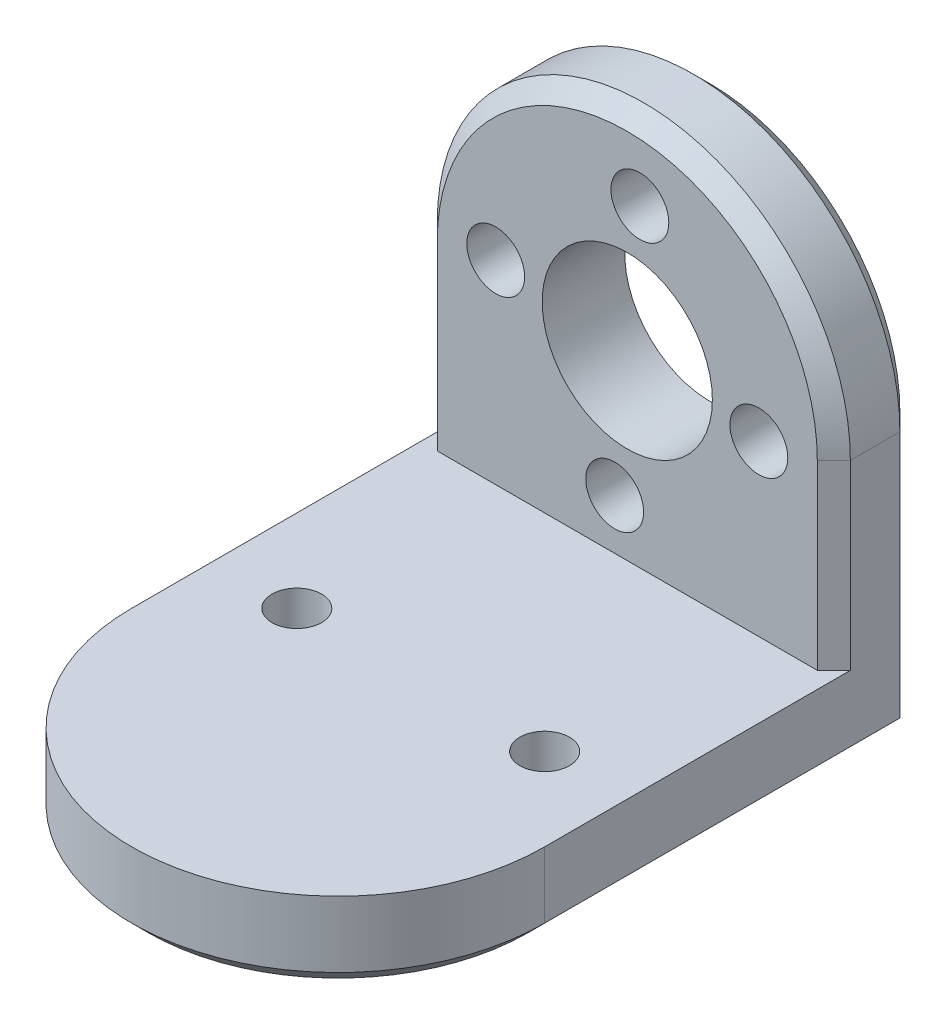
ISO-10303-21;
HEADER;
FILE_DESCRIPTION(('STEP AP214'),'2;1');
FILE_NAME('part.step','',(''),(''),'','','');
FILE_SCHEMA(('AUTOMOTIVE_DESIGN { 1 0 10303 214 1 1 1 1 }'));
ENDSEC;
DATA;
#1=APPLICATION_CONTEXT('core data for automotive mechanical design processes');
#2=APPLICATION_PROTOCOL_DEFINITION('international standard','automotive_design',2000,#1);
#3=PRODUCT_CONTEXT('',#1,'mechanical');
#4=PRODUCT('Part','Part','',(#3));
#5=PRODUCT_RELATED_PRODUCT_CATEGORY('part','',(#4));
#6=PRODUCT_DEFINITION_FORMATION('','',#4);
#7=PRODUCT_DEFINITION_CONTEXT('part definition',#1,'design');
#8=PRODUCT_DEFINITION('design','',#6,#7);
#9=PRODUCT_DEFINITION_SHAPE('','',#8);
#10=(LENGTH_UNIT() NAMED_UNIT(*) SI_UNIT(.MILLI.,.METRE.));
#11=(NAMED_UNIT(*) PLANE_ANGLE_UNIT() SI_UNIT($,.RADIAN.));
#12=(NAMED_UNIT(*) SI_UNIT($,.STERADIAN.) SOLID_ANGLE_UNIT());
#13=UNCERTAINTY_MEASURE_WITH_UNIT(LENGTH_MEASURE(1.E-05),#10,'distance_accuracy_value','');
#14=(GEOMETRIC_REPRESENTATION_CONTEXT(3) GLOBAL_UNCERTAINTY_ASSIGNED_CONTEXT((#13)) GLOBAL_UNIT_ASSIGNED_CONTEXT((#10,
#11,#12)) REPRESENTATION_CONTEXT('',''));
#15=CARTESIAN_POINT('',(0.,0.,0.));
#16=DIRECTION('',(0.,0.,1.));
#17=DIRECTION('',(1.,0.,0.));
#18=AXIS2_PLACEMENT_3D('',#15,#16,#17);
#19=CARTESIAN_POINT('',(12.5,-16.,5.));
#20=DIRECTION('',(0.,-1.,0.));
#21=DIRECTION('',(1.,0.,0.));
#22=AXIS2_PLACEMENT_3D('',#19,#20,#21);
#23=PLANE('',#22);
#24=DIRECTION('',(-1.,0.,0.));
#25=VECTOR('',#24,1.);
#26=CARTESIAN_POINT('',(12.5,-16.,0.));
#27=LINE('',#26,#25);
#28=CARTESIAN_POINT('',(11.5,-16.,0.));
#29=VERTEX_POINT('',#28);
#30=CARTESIAN_POINT('',(-11.5,-16.,0.));
#31=VERTEX_POINT('',#30);
#32=EDGE_CURVE('E158',#29,#31,#27,.T.);
#33=ORIENTED_EDGE('',*,*,#32,.F.);
#34=DIRECTION('',(0.,0.,1.));
#35=VECTOR('',#34,1.);
#36=CARTESIAN_POINT('',(11.5,-16.,5.));
#37=LINE('',#36,#35);
#38=CARTESIAN_POINT('',(11.5,-16.,22.5));
#39=VERTEX_POINT('',#38);
#40=EDGE_CURVE('E55',#29,#39,#37,.T.);
#41=ORIENTED_EDGE('',*,*,#40,.T.);
#42=CARTESIAN_POINT('',(0.,-16.,22.5));
#43=DIRECTION('',(0.,-1.,0.));
#44=DIRECTION('',(1.,0.,0.));
#45=AXIS2_PLACEMENT_3D('',#42,#43,#44);
#46=CIRCLE('',#45,11.5);
#47=CARTESIAN_POINT('',(-11.5,-16.,22.5));
#48=VERTEX_POINT('',#47);
#49=EDGE_CURVE('E63',#39,#48,#46,.T.);
#50=ORIENTED_EDGE('',*,*,#49,.T.);
#51=DIRECTION('',(0.,0.,-1.));
#52=VECTOR('',#51,1.);
#53=CARTESIAN_POINT('',(-11.5,-16.,5.));
#54=LINE('',#53,#52);
#55=EDGE_CURVE('E217',#48,#31,#54,.T.);
#56=ORIENTED_EDGE('',*,*,#55,.T.);
#57=EDGE_LOOP('',(#33,#41,#50,#56));
#58=FACE_BOUND('',#57,.T.);
#59=CARTESIAN_POINT('',(7.5,-16.,17.5));
#60=DIRECTION('',(0.,-1.,0.));
#61=DIRECTION('',(0.,0.,-1.));
#62=AXIS2_PLACEMENT_3D('',#59,#60,#61);
#63=CIRCLE('',#62,1.5);
#64=CARTESIAN_POINT('',(7.5,-16.,16.));
#65=VERTEX_POINT('',#64);
#66=EDGE_CURVE('E199',#65,#65,#63,.T.);
#67=ORIENTED_EDGE('',*,*,#66,.F.);
#68=EDGE_LOOP('',(#67));
#69=FACE_BOUND('',#68,.T.);
#70=CARTESIAN_POINT('',(-7.5,-16.,17.5));
#71=DIRECTION('',(0.,1.,0.));
#72=DIRECTION('',(0.,0.,1.));
#73=AXIS2_PLACEMENT_3D('',#70,#71,#72);
#74=CIRCLE('',#73,1.5);
#75=CARTESIAN_POINT('',(-7.5,-16.,19.));
#76=VERTEX_POINT('',#75);
#77=EDGE_CURVE('E291',#76,#76,#74,.T.);
#78=ORIENTED_EDGE('',*,*,#77,.T.);
#79=EDGE_LOOP('',(#78));
#80=FACE_BOUND('',#79,.T.);
#81=ADVANCED_FACE('F45',(#58,#69,#80),#23,.T.);
#82=CARTESIAN_POINT('',(-12.5,-11.,35.));
#83=DIRECTION('',(0.,-1.,0.));
#84=DIRECTION('',(0.,0.,-1.));
#85=AXIS2_PLACEMENT_3D('',#82,#83,#84);
#86=PLANE('',#85);
#87=DIRECTION('',(0.,0.,-1.));
#88=VECTOR('',#87,1.);
#89=CARTESIAN_POINT('',(-12.5,-11.,35.));
#90=LINE('',#89,#88);
#91=CARTESIAN_POINT('',(-12.5,-11.,22.5));
#92=VERTEX_POINT('',#91);
#93=CARTESIAN_POINT('',(-12.5,-11.,4.));
#94=VERTEX_POINT('',#93);
#95=EDGE_CURVE('E132',#92,#94,#90,.T.);
#96=ORIENTED_EDGE('',*,*,#95,.F.);
#97=CARTESIAN_POINT('',(0.,-11.,22.5));
#98=DIRECTION('',(0.,-1.,0.));
#99=DIRECTION('',(0.,0.,-1.));
#100=AXIS2_PLACEMENT_3D('',#97,#98,#99);
#101=CIRCLE('',#100,12.5);
#102=CARTESIAN_POINT('',(12.5,-11.,22.5));
#103=VERTEX_POINT('',#102);
#104=EDGE_CURVE('E142',#92,#103,#101,.F.);
#105=ORIENTED_EDGE('',*,*,#104,.T.);
#106=DIRECTION('',(0.,0.,-1.));
#107=VECTOR('',#106,1.);
#108=CARTESIAN_POINT('',(12.5,-11.,35.));
#109=LINE('',#108,#107);
#110=CARTESIAN_POINT('',(12.5,-11.,4.));
#111=VERTEX_POINT('',#110);
#112=EDGE_CURVE('E155',#103,#111,#109,.T.);
#113=ORIENTED_EDGE('',*,*,#112,.T.);
#114=DIRECTION('',(0.707106781186544,0.,-0.707106781186551));
#115=VECTOR('',#114,1.);
#116=CARTESIAN_POINT('',(-15.4999999999999,-11.,32.0000000000001));
#117=LINE('',#116,#115);
#118=CARTESIAN_POINT('',(11.5,-11.,5.));
#119=VERTEX_POINT('',#118);
#120=EDGE_CURVE('E189',#111,#119,#117,.F.);
#121=ORIENTED_EDGE('',*,*,#120,.T.);
#122=DIRECTION('',(-1.,0.,0.));
#123=VECTOR('',#122,1.);
#124=CARTESIAN_POINT('',(-12.5,-11.,5.));
#125=LINE('',#124,#123);
#126=CARTESIAN_POINT('',(-11.5,-11.,5.));
#127=VERTEX_POINT('',#126);
#128=EDGE_CURVE('E156',#119,#127,#125,.T.);
#129=ORIENTED_EDGE('',*,*,#128,.T.);
#130=DIRECTION('',(0.707106781186544,0.,0.707106781186551));
#131=VECTOR('',#130,1.);
#132=CARTESIAN_POINT('',(2.99999999999999,-11.,19.5000000000001));
#133=LINE('',#132,#131);
#134=EDGE_CURVE('E153',#127,#94,#133,.F.);
#135=ORIENTED_EDGE('',*,*,#134,.T.);
#136=EDGE_LOOP('',(#96,#105,#113,#121,#129,#135));
#137=FACE_BOUND('',#136,.T.);
#138=CARTESIAN_POINT('',(7.5,-11.,17.5));
#139=DIRECTION('',(0.,-1.,0.));
#140=DIRECTION('',(0.,0.,-1.));
#141=AXIS2_PLACEMENT_3D('',#138,#139,#140);
#142=CIRCLE('',#141,1.5);
#143=CARTESIAN_POINT('',(7.5,-11.,16.));
#144=VERTEX_POINT('',#143);
#145=EDGE_CURVE('E300',#144,#144,#142,.T.);
#146=ORIENTED_EDGE('',*,*,#145,.T.);
#147=EDGE_LOOP('',(#146));
#148=FACE_BOUND('',#147,.T.);
#149=CARTESIAN_POINT('',(-7.5,-11.,17.5));
#150=DIRECTION('',(0.,1.,0.));
#151=DIRECTION('',(0.,0.,1.));
#152=AXIS2_PLACEMENT_3D('',#149,#150,#151);
#153=CIRCLE('',#152,1.5);
#154=CARTESIAN_POINT('',(-7.5,-11.,19.));
#155=VERTEX_POINT('',#154);
#156=EDGE_CURVE('E294',#155,#155,#153,.T.);
#157=ORIENTED_EDGE('',*,*,#156,.F.);
#158=EDGE_LOOP('',(#157));
#159=FACE_BOUND('',#158,.T.);
#160=ADVANCED_FACE('F149',(#137,#148,#159),#86,.F.);
#161=CARTESIAN_POINT('',(0.,-16.,22.5));
#162=DIRECTION('',(0.,-1.,0.));
#163=DIRECTION('',(1.,0.,0.));
#164=AXIS2_PLACEMENT_3D('',#161,#162,#163);
#165=CYLINDRICAL_SURFACE('',#164,12.5);
#166=DIRECTION('',(0.,-1.,0.));
#167=VECTOR('',#166,1.);
#168=CARTESIAN_POINT('',(-12.5,0.,22.5));
#169=LINE('',#168,#167);
#170=CARTESIAN_POINT('',(-12.5,-15.,22.5));
#171=VERTEX_POINT('',#170);
#172=EDGE_CURVE('E127',#171,#92,#169,.F.);
#173=ORIENTED_EDGE('',*,*,#172,.F.);
#174=CARTESIAN_POINT('',(0.,-15.,22.5));
#175=DIRECTION('',(0.,-1.,0.));
#176=DIRECTION('',(1.,0.,0.));
#177=AXIS2_PLACEMENT_3D('',#174,#175,#176);
#178=CIRCLE('',#177,12.5);
#179=CARTESIAN_POINT('',(12.5,-15.,22.5));
#180=VERTEX_POINT('',#179);
#181=EDGE_CURVE('E11',#171,#180,#178,.F.);
#182=ORIENTED_EDGE('',*,*,#181,.T.);
#183=DIRECTION('',(0.,-1.,0.));
#184=VECTOR('',#183,1.);
#185=CARTESIAN_POINT('',(12.5,0.,22.5));
#186=LINE('',#185,#184);
#187=EDGE_CURVE('E138',#103,#180,#186,.T.);
#188=ORIENTED_EDGE('',*,*,#187,.F.);
#189=ORIENTED_EDGE('',*,*,#104,.F.);
#190=EDGE_LOOP('',(#173,#182,#188,#189));
#191=FACE_BOUND('',#190,.T.);
#192=ADVANCED_FACE('F143',(#191),#165,.T.);
#193=CARTESIAN_POINT('',(0.,0.,5.));
#194=DIRECTION('',(0.,0.,-1.));
#195=DIRECTION('',(-1.,0.,0.));
#196=AXIS2_PLACEMENT_3D('',#193,#194,#195);
#197=CYLINDRICAL_SURFACE('',#196,12.5);
#198=DIRECTION('',(0.,0.,-1.));
#199=VECTOR('',#198,1.);
#200=CARTESIAN_POINT('',(12.5,0.,5.));
#201=LINE('',#200,#199);
#202=CARTESIAN_POINT('',(12.5,0.,4.));
#203=VERTEX_POINT('',#202);
#204=CARTESIAN_POINT('',(12.5,0.,1.));
#205=VERTEX_POINT('',#204);
#206=EDGE_CURVE('E166',#203,#205,#201,.T.);
#207=ORIENTED_EDGE('',*,*,#206,.T.);
#208=CARTESIAN_POINT('',(0.,0.,1.));
#209=DIRECTION('',(0.,0.,1.));
#210=DIRECTION('',(1.,0.,0.));
#211=AXIS2_PLACEMENT_3D('',#208,#209,#210);
#212=CIRCLE('',#211,12.5);
#213=CARTESIAN_POINT('',(-12.5,0.,1.00000000000001));
#214=VERTEX_POINT('',#213);
#215=EDGE_CURVE('E211',#205,#214,#212,.T.);
#216=ORIENTED_EDGE('',*,*,#215,.T.);
#217=DIRECTION('',(0.,0.,-1.));
#218=VECTOR('',#217,1.);
#219=CARTESIAN_POINT('',(-12.5,0.,5.));
#220=LINE('',#219,#218);
#221=CARTESIAN_POINT('',(-12.5,0.,4.));
#222=VERTEX_POINT('',#221);
#223=EDGE_CURVE('E167',#222,#214,#220,.T.);
#224=ORIENTED_EDGE('',*,*,#223,.F.);
#225=CARTESIAN_POINT('',(0.,0.,4.));
#226=DIRECTION('',(0.,0.,1.));
#227=DIRECTION('',(1.,0.,0.));
#228=AXIS2_PLACEMENT_3D('',#225,#226,#227);
#229=CIRCLE('',#228,12.5);
#230=EDGE_CURVE('E187',#222,#203,#229,.F.);
#231=ORIENTED_EDGE('',*,*,#230,.T.);
#232=EDGE_LOOP('',(#207,#216,#224,#231));
#233=FACE_BOUND('',#232,.T.);
#234=ADVANCED_FACE('F268',(#233),#197,.T.);
#235=CARTESIAN_POINT('',(0.,0.,5.));
#236=DIRECTION('',(0.,0.,1.));
#237=DIRECTION('',(1.,0.,0.));
#238=AXIS2_PLACEMENT_3D('',#235,#236,#237);
#239=PLANE('',#238);
#240=ORIENTED_EDGE('',*,*,#128,.F.);
#241=DIRECTION('',(0.,1.,0.));
#242=VECTOR('',#241,1.);
#243=CARTESIAN_POINT('',(11.5,0.,5.));
#244=LINE('',#243,#242);
#245=CARTESIAN_POINT('',(11.5,0.,5.));
#246=VERTEX_POINT('',#245);
#247=EDGE_CURVE('E183',#119,#246,#244,.T.);
#248=ORIENTED_EDGE('',*,*,#247,.T.);
#249=CARTESIAN_POINT('',(0.,0.,5.));
#250=DIRECTION('',(0.,0.,1.));
#251=DIRECTION('',(1.,0.,0.));
#252=AXIS2_PLACEMENT_3D('',#249,#250,#251);
#253=CIRCLE('',#252,11.5);
#254=CARTESIAN_POINT('',(-11.5,0.,5.));
#255=VERTEX_POINT('',#254);
#256=EDGE_CURVE('E179',#246,#255,#253,.T.);
#257=ORIENTED_EDGE('',*,*,#256,.T.);
#258=DIRECTION('',(0.,-1.,0.));
#259=VECTOR('',#258,1.);
#260=CARTESIAN_POINT('',(-11.5,0.,5.));
#261=LINE('',#260,#259);
#262=EDGE_CURVE('E181',#255,#127,#261,.T.);
#263=ORIENTED_EDGE('',*,*,#262,.T.);
#264=EDGE_LOOP('',(#240,#248,#257,#263));
#265=FACE_BOUND('',#264,.T.);
#266=CARTESIAN_POINT('',(0.762684290658525,7.96356155704086,5.));
#267=DIRECTION('',(0.,0.,1.));
#268=DIRECTION('',(1.,0.,0.));
#269=AXIS2_PLACEMENT_3D('',#266,#267,#268);
#270=CIRCLE('',#269,1.75000000000144);
#271=CARTESIAN_POINT('',(2.51268429065997,7.96356155704086,5.));
#272=VERTEX_POINT('',#271);
#273=EDGE_CURVE('E160',#272,#272,#270,.T.);
#274=ORIENTED_EDGE('',*,*,#273,.F.);
#275=EDGE_LOOP('',(#274));
#276=FACE_BOUND('',#275,.T.);
#277=CARTESIAN_POINT('',(7.96356155704106,-0.762684290658769,5.));
#278=DIRECTION('',(0.,0.,1.));
#279=DIRECTION('',(1.,0.,0.));
#280=AXIS2_PLACEMENT_3D('',#277,#278,#279);
#281=CIRCLE('',#280,1.75000000000156);
#282=CARTESIAN_POINT('',(9.71356155704262,-0.762684290658769,5.));
#283=VERTEX_POINT('',#282);
#284=EDGE_CURVE('E320',#283,#283,#281,.T.);
#285=ORIENTED_EDGE('',*,*,#284,.F.);
#286=EDGE_LOOP('',(#285));
#287=FACE_BOUND('',#286,.T.);
#288=CARTESIAN_POINT('',(-7.96356155704111,0.762684290658319,5.));
#289=DIRECTION('',(0.,0.,1.));
#290=DIRECTION('',(1.,0.,0.));
#291=AXIS2_PLACEMENT_3D('',#288,#289,#290);
#292=CIRCLE('',#291,1.75000000000108);
#293=CARTESIAN_POINT('',(-6.21356155704003,0.762684290658319,5.));
#294=VERTEX_POINT('',#293);
#295=EDGE_CURVE('E317',#294,#294,#292,.T.);
#296=ORIENTED_EDGE('',*,*,#295,.F.);
#297=EDGE_LOOP('',(#296));
#298=FACE_BOUND('',#297,.T.);
#299=CARTESIAN_POINT('',(-0.76268429065857,-7.96356155704131,5.));
#300=DIRECTION('',(0.,0.,1.));
#301=DIRECTION('',(1.,0.,0.));
#302=AXIS2_PLACEMENT_3D('',#299,#300,#301);
#303=CIRCLE('',#302,1.75000000000126);
#304=CARTESIAN_POINT('',(0.98731570934269,-7.96356155704131,5.));
#305=VERTEX_POINT('',#304);
#306=EDGE_CURVE('E309',#305,#305,#303,.T.);
#307=ORIENTED_EDGE('',*,*,#306,.F.);
#308=EDGE_LOOP('',(#307));
#309=FACE_BOUND('',#308,.T.);
#310=CARTESIAN_POINT('',(0.,0.,5.));
#311=DIRECTION('',(0.,0.,1.));
#312=DIRECTION('',(1.,0.,0.));
#313=AXIS2_PLACEMENT_3D('',#310,#311,#312);
#314=CIRCLE('',#313,5.15);
#315=CARTESIAN_POINT('',(5.15,0.,5.));
#316=VERTEX_POINT('',#315);
#317=EDGE_CURVE('E139',#316,#316,#314,.T.);
#318=ORIENTED_EDGE('',*,*,#317,.F.);
#319=EDGE_LOOP('',(#318));
#320=FACE_BOUND('',#319,.T.);
#321=ADVANCED_FACE('F257',(#265,#276,#287,#298,#309,#320),#239,.T.);
#322=CARTESIAN_POINT('',(0.,0.,0.));
#323=DIRECTION('',(0.,0.,1.));
#324=DIRECTION('',(1.,0.,0.));
#325=AXIS2_PLACEMENT_3D('',#322,#323,#324);
#326=PLANE('',#325);
#327=CARTESIAN_POINT('',(0.762684290658525,7.96356155704086,0.));
#328=DIRECTION('',(0.,0.,-1.));
#329=DIRECTION('',(-1.,0.,0.));
#330=AXIS2_PLACEMENT_3D('',#327,#328,#329);
#331=CIRCLE('',#330,1.75000000000144);
#332=CARTESIAN_POINT('',(-0.987315709342918,7.96356155704086,0.));
#333=VERTEX_POINT('',#332);
#334=EDGE_CURVE('E306',#333,#333,#331,.T.);
#335=ORIENTED_EDGE('',*,*,#334,.F.);
#336=EDGE_LOOP('',(#335));
#337=FACE_BOUND('',#336,.T.);
#338=CARTESIAN_POINT('',(7.96356155704106,-0.762684290658769,0.));
#339=DIRECTION('',(0.,0.,-1.));
#340=DIRECTION('',(-1.,0.,0.));
#341=AXIS2_PLACEMENT_3D('',#338,#339,#340);
#342=CIRCLE('',#341,1.75000000000156);
#343=CARTESIAN_POINT('',(6.2135615570395,-0.762684290658769,0.));
#344=VERTEX_POINT('',#343);
#345=EDGE_CURVE('E310',#344,#344,#342,.T.);
#346=ORIENTED_EDGE('',*,*,#345,.F.);
#347=EDGE_LOOP('',(#346));
#348=FACE_BOUND('',#347,.T.);
#349=CARTESIAN_POINT('',(-7.96356155704111,0.762684290658319,0.));
#350=DIRECTION('',(0.,0.,-1.));
#351=DIRECTION('',(-1.,0.,0.));
#352=AXIS2_PLACEMENT_3D('',#349,#350,#351);
#353=CIRCLE('',#352,1.75000000000108);
#354=CARTESIAN_POINT('',(-9.71356155704219,0.762684290658319,0.));
#355=VERTEX_POINT('',#354);
#356=EDGE_CURVE('E297',#355,#355,#353,.T.);
#357=ORIENTED_EDGE('',*,*,#356,.F.);
#358=EDGE_LOOP('',(#357));
#359=FACE_BOUND('',#358,.T.);
#360=CARTESIAN_POINT('',(-0.76268429065857,-7.96356155704131,0.));
#361=DIRECTION('',(0.,0.,-1.));
#362=DIRECTION('',(-1.,0.,0.));
#363=AXIS2_PLACEMENT_3D('',#360,#361,#362);
#364=CIRCLE('',#363,1.75000000000126);
#365=CARTESIAN_POINT('',(-2.51268429065983,-7.96356155704131,0.));
#366=VERTEX_POINT('',#365);
#367=EDGE_CURVE('E293',#366,#366,#364,.T.);
#368=ORIENTED_EDGE('',*,*,#367,.F.);
#369=EDGE_LOOP('',(#368));
#370=FACE_BOUND('',#369,.T.);
#371=CARTESIAN_POINT('',(0.,0.,0.));
#372=DIRECTION('',(0.,0.,1.));
#373=DIRECTION('',(1.,0.,0.));
#374=AXIS2_PLACEMENT_3D('',#371,#372,#373);
#375=CIRCLE('',#374,11.5);
#376=CARTESIAN_POINT('',(-11.5,0.,0.));
#377=VERTEX_POINT('',#376);
#378=CARTESIAN_POINT('',(11.5,0.,0.));
#379=VERTEX_POINT('',#378);
#380=EDGE_CURVE('E201',#377,#379,#375,.F.);
#381=ORIENTED_EDGE('',*,*,#380,.T.);
#382=DIRECTION('',(0.,-1.,0.));
#383=VECTOR('',#382,1.);
#384=CARTESIAN_POINT('',(11.5,-16.,0.));
#385=LINE('',#384,#383);
#386=EDGE_CURVE('E203',#379,#29,#385,.T.);
#387=ORIENTED_EDGE('',*,*,#386,.T.);
#388=ORIENTED_EDGE('',*,*,#32,.T.);
#389=DIRECTION('',(0.,1.,0.));
#390=VECTOR('',#389,1.);
#391=CARTESIAN_POINT('',(-11.5,0.,0.));
#392=LINE('',#391,#390);
#393=EDGE_CURVE('E192',#31,#377,#392,.T.);
#394=ORIENTED_EDGE('',*,*,#393,.T.);
#395=EDGE_LOOP('',(#381,#387,#388,#394));
#396=FACE_BOUND('',#395,.T.);
#397=CARTESIAN_POINT('',(0.,0.,0.));
#398=DIRECTION('',(0.,0.,1.));
#399=DIRECTION('',(1.,0.,0.));
#400=AXIS2_PLACEMENT_3D('',#397,#398,#399);
#401=CIRCLE('',#400,5.15);
#402=CARTESIAN_POINT('',(5.15,0.,0.));
#403=VERTEX_POINT('',#402);
#404=EDGE_CURVE('E169',#403,#403,#401,.T.);
#405=ORIENTED_EDGE('',*,*,#404,.T.);
#406=EDGE_LOOP('',(#405));
#407=FACE_BOUND('',#406,.T.);
#408=ADVANCED_FACE('F281',(#337,#348,#359,#370,#396,#407),#326,.F.);
#409=CARTESIAN_POINT('',(0.,0.,5.));
#410=DIRECTION('',(0.,0.,-1.));
#411=DIRECTION('',(-1.,0.,0.));
#412=AXIS2_PLACEMENT_3D('',#409,#410,#411);
#413=CYLINDRICAL_SURFACE('',#412,5.15);
#414=ORIENTED_EDGE('',*,*,#317,.T.);
#415=EDGE_LOOP('',(#414));
#416=FACE_BOUND('',#415,.T.);
#417=ORIENTED_EDGE('',*,*,#404,.F.);
#418=EDGE_LOOP('',(#417));
#419=FACE_BOUND('',#418,.T.);
#420=ADVANCED_FACE('F338',(#416,#419),#413,.F.);
#421=CARTESIAN_POINT('',(-12.5,0.,5.));
#422=DIRECTION('',(-1.,0.,0.));
#423=DIRECTION('',(0.,-1.,0.));
#424=AXIS2_PLACEMENT_3D('',#421,#422,#423);
#425=PLANE('',#424);
#426=ORIENTED_EDGE('',*,*,#223,.T.);
#427=DIRECTION('',(0.,-1.,0.));
#428=VECTOR('',#427,1.);
#429=CARTESIAN_POINT('',(-12.5,-16.,1.00000000000001));
#430=LINE('',#429,#428);
#431=CARTESIAN_POINT('',(-12.5,-15.,1.00000000000001));
#432=VERTEX_POINT('',#431);
#433=EDGE_CURVE('E214',#214,#432,#430,.T.);
#434=ORIENTED_EDGE('',*,*,#433,.T.);
#435=DIRECTION('',(0.,0.,1.));
#436=VECTOR('',#435,1.);
#437=CARTESIAN_POINT('',(-12.5,-15.,5.));
#438=LINE('',#437,#436);
#439=EDGE_CURVE('E135',#432,#171,#438,.T.);
#440=ORIENTED_EDGE('',*,*,#439,.T.);
#441=ORIENTED_EDGE('',*,*,#172,.T.);
#442=ORIENTED_EDGE('',*,*,#95,.T.);
#443=DIRECTION('',(0.,1.,0.));
#444=VECTOR('',#443,1.);
#445=CARTESIAN_POINT('',(-12.5,0.,4.));
#446=LINE('',#445,#444);
#447=EDGE_CURVE('E185',#94,#222,#446,.T.);
#448=ORIENTED_EDGE('',*,*,#447,.T.);
#449=EDGE_LOOP('',(#426,#434,#440,#441,#442,#448));
#450=FACE_BOUND('',#449,.T.);
#451=ADVANCED_FACE('F130',(#450),#425,.T.);
#452=CARTESIAN_POINT('',(12.5,0.,5.));
#453=DIRECTION('',(1.,0.,0.));
#454=DIRECTION('',(0.,1.,0.));
#455=AXIS2_PLACEMENT_3D('',#452,#453,#454);
#456=PLANE('',#455);
#457=DIRECTION('',(0.,0.,-1.));
#458=VECTOR('',#457,1.);
#459=CARTESIAN_POINT('',(12.5,-15.,5.));
#460=LINE('',#459,#458);
#461=CARTESIAN_POINT('',(12.5,-15.,1.00000000000001));
#462=VERTEX_POINT('',#461);
#463=EDGE_CURVE('E206',#180,#462,#460,.T.);
#464=ORIENTED_EDGE('',*,*,#463,.T.);
#465=DIRECTION('',(0.,1.,0.));
#466=VECTOR('',#465,1.);
#467=CARTESIAN_POINT('',(12.5,0.,1.00000000000001));
#468=LINE('',#467,#466);
#469=EDGE_CURVE('E208',#462,#205,#468,.T.);
#470=ORIENTED_EDGE('',*,*,#469,.T.);
#471=ORIENTED_EDGE('',*,*,#206,.F.);
#472=DIRECTION('',(0.,-1.,0.));
#473=VECTOR('',#472,1.);
#474=CARTESIAN_POINT('',(12.5,0.,4.));
#475=LINE('',#474,#473);
#476=EDGE_CURVE('E147',#203,#111,#475,.T.);
#477=ORIENTED_EDGE('',*,*,#476,.T.);
#478=ORIENTED_EDGE('',*,*,#112,.F.);
#479=ORIENTED_EDGE('',*,*,#187,.T.);
#480=EDGE_LOOP('',(#464,#470,#471,#477,#478,#479));
#481=FACE_BOUND('',#480,.T.);
#482=ADVANCED_FACE('F245',(#481),#456,.T.);
#483=CARTESIAN_POINT('',(-0.76268429065857,-7.96356155704131,35.));
#484=DIRECTION('',(0.,0.,-1.));
#485=DIRECTION('',(-1.,0.,0.));
#486=AXIS2_PLACEMENT_3D('',#483,#484,#485);
#487=CYLINDRICAL_SURFACE('',#486,1.75000000000126);
#488=ORIENTED_EDGE('',*,*,#306,.T.);
#489=EDGE_LOOP('',(#488));
#490=FACE_BOUND('',#489,.T.);
#491=ORIENTED_EDGE('',*,*,#367,.T.);
#492=EDGE_LOOP('',(#491));
#493=FACE_BOUND('',#492,.T.);
#494=ADVANCED_FACE('F453',(#490,#493),#487,.F.);
#495=CARTESIAN_POINT('',(-7.96356155704111,0.762684290658319,35.));
#496=DIRECTION('',(0.,0.,-1.));
#497=DIRECTION('',(-1.,0.,0.));
#498=AXIS2_PLACEMENT_3D('',#495,#496,#497);
#499=CYLINDRICAL_SURFACE('',#498,1.75000000000108);
#500=ORIENTED_EDGE('',*,*,#295,.T.);
#501=EDGE_LOOP('',(#500));
#502=FACE_BOUND('',#501,.T.);
#503=ORIENTED_EDGE('',*,*,#356,.T.);
#504=EDGE_LOOP('',(#503));
#505=FACE_BOUND('',#504,.T.);
#506=ADVANCED_FACE('F445',(#502,#505),#499,.F.);
#507=CARTESIAN_POINT('',(7.96356155704106,-0.762684290658769,35.));
#508=DIRECTION('',(0.,0.,-1.));
#509=DIRECTION('',(-1.,0.,0.));
#510=AXIS2_PLACEMENT_3D('',#507,#508,#509);
#511=CYLINDRICAL_SURFACE('',#510,1.75000000000156);
#512=ORIENTED_EDGE('',*,*,#284,.T.);
#513=EDGE_LOOP('',(#512));
#514=FACE_BOUND('',#513,.T.);
#515=ORIENTED_EDGE('',*,*,#345,.T.);
#516=EDGE_LOOP('',(#515));
#517=FACE_BOUND('',#516,.T.);
#518=ADVANCED_FACE('F438',(#514,#517),#511,.F.);
#519=CARTESIAN_POINT('',(0.762684290658525,7.96356155704086,35.));
#520=DIRECTION('',(0.,0.,-1.));
#521=DIRECTION('',(-1.,0.,0.));
#522=AXIS2_PLACEMENT_3D('',#519,#520,#521);
#523=CYLINDRICAL_SURFACE('',#522,1.75000000000144);
#524=ORIENTED_EDGE('',*,*,#273,.T.);
#525=EDGE_LOOP('',(#524));
#526=FACE_BOUND('',#525,.T.);
#527=ORIENTED_EDGE('',*,*,#334,.T.);
#528=EDGE_LOOP('',(#527));
#529=FACE_BOUND('',#528,.T.);
#530=ADVANCED_FACE('F325',(#526,#529),#523,.F.);
#531=CARTESIAN_POINT('',(7.5,-16.,17.5));
#532=DIRECTION('',(0.,1.,0.));
#533=DIRECTION('',(0.,0.,1.));
#534=AXIS2_PLACEMENT_3D('',#531,#532,#533);
#535=CYLINDRICAL_SURFACE('',#534,1.5);
#536=ORIENTED_EDGE('',*,*,#66,.T.);
#537=EDGE_LOOP('',(#536));
#538=FACE_BOUND('',#537,.T.);
#539=ORIENTED_EDGE('',*,*,#145,.F.);
#540=EDGE_LOOP('',(#539));
#541=FACE_BOUND('',#540,.T.);
#542=ADVANCED_FACE('F423',(#538,#541),#535,.F.);
#543=CARTESIAN_POINT('',(-7.5,-16.,17.5));
#544=DIRECTION('',(0.,1.,0.));
#545=DIRECTION('',(0.,0.,1.));
#546=AXIS2_PLACEMENT_3D('',#543,#544,#545);
#547=CYLINDRICAL_SURFACE('',#546,1.5);
#548=ORIENTED_EDGE('',*,*,#77,.F.);
#549=EDGE_LOOP('',(#548));
#550=FACE_BOUND('',#549,.T.);
#551=ORIENTED_EDGE('',*,*,#156,.T.);
#552=EDGE_LOOP('',(#551));
#553=FACE_BOUND('',#552,.T.);
#554=ADVANCED_FACE('F373',(#550,#553),#547,.F.);
#555=CARTESIAN_POINT('',(-12.5,0.,4.));
#556=DIRECTION('',(0.707106781186551,0.,-0.707106781186544));
#557=DIRECTION('',(0.,1.,0.));
#558=AXIS2_PLACEMENT_3D('',#555,#556,#557);
#559=PLANE('',#558);
#560=ORIENTED_EDGE('',*,*,#134,.F.);
#561=ORIENTED_EDGE('',*,*,#262,.F.);
#562=DIRECTION('',(0.707106781186544,0.,0.707106781186551));
#563=VECTOR('',#562,1.);
#564=CARTESIAN_POINT('',(-12.5,0.,4.));
#565=LINE('',#564,#563);
#566=EDGE_CURVE('E196',#222,#255,#565,.T.);
#567=ORIENTED_EDGE('',*,*,#566,.F.);
#568=ORIENTED_EDGE('',*,*,#447,.F.);
#569=EDGE_LOOP('',(#560,#561,#567,#568));
#570=FACE_BOUND('',#569,.T.);
#571=ADVANCED_FACE('F265',(#570),#559,.F.);
#572=CARTESIAN_POINT('',(0.,0.,5.));
#573=DIRECTION('',(0.,0.,-1.));
#574=DIRECTION('',(-1.,0.,0.));
#575=AXIS2_PLACEMENT_3D('',#572,#573,#574);
#576=CONICAL_SURFACE('',#575,11.5,0.785398163397444);
#577=ORIENTED_EDGE('',*,*,#566,.T.);
#578=ORIENTED_EDGE('',*,*,#256,.F.);
#579=DIRECTION('',(-0.707106781186544,0.,0.707106781186551));
#580=VECTOR('',#579,1.);
#581=CARTESIAN_POINT('',(12.5,0.,4.));
#582=LINE('',#581,#580);
#583=EDGE_CURVE('E193',#203,#246,#582,.T.);
#584=ORIENTED_EDGE('',*,*,#583,.F.);
#585=ORIENTED_EDGE('',*,*,#230,.F.);
#586=EDGE_LOOP('',(#577,#578,#584,#585));
#587=FACE_BOUND('',#586,.T.);
#588=ADVANCED_FACE('F261',(#587),#576,.T.);
#589=CARTESIAN_POINT('',(12.5,0.,4.));
#590=DIRECTION('',(-0.707106781186551,0.,-0.707106781186544));
#591=DIRECTION('',(0.,-1.,0.));
#592=AXIS2_PLACEMENT_3D('',#589,#590,#591);
#593=PLANE('',#592);
#594=ORIENTED_EDGE('',*,*,#583,.T.);
#595=ORIENTED_EDGE('',*,*,#247,.F.);
#596=ORIENTED_EDGE('',*,*,#120,.F.);
#597=ORIENTED_EDGE('',*,*,#476,.F.);
#598=EDGE_LOOP('',(#594,#595,#596,#597));
#599=FACE_BOUND('',#598,.T.);
#600=ADVANCED_FACE('F253',(#599),#593,.F.);
#601=CARTESIAN_POINT('',(-11.5,-16.,5.));
#602=DIRECTION('',(0.707106781186553,0.707106781186542,0.));
#603=DIRECTION('',(0.,0.,-1.));
#604=AXIS2_PLACEMENT_3D('',#601,#602,#603);
#605=PLANE('',#604);
#606=DIRECTION('',(0.707106781186542,-0.707106781186553,0.));
#607=VECTOR('',#606,1.);
#608=CARTESIAN_POINT('',(-12.5,-15.,22.5));
#609=LINE('',#608,#607);
#610=EDGE_CURVE('E229',#171,#48,#609,.T.);
#611=ORIENTED_EDGE('',*,*,#610,.F.);
#612=ORIENTED_EDGE('',*,*,#439,.F.);
#613=DIRECTION('',(-0.57735026918962,0.577350269189629,0.577350269189628));
#614=VECTOR('',#613,1.);
#615=CARTESIAN_POINT('',(-13.1666666666667,-14.3333333333333,1.66666666666668));
#616=LINE('',#615,#614);
#617=EDGE_CURVE('E50',#31,#432,#616,.T.);
#618=ORIENTED_EDGE('',*,*,#617,.F.);
#619=ORIENTED_EDGE('',*,*,#55,.F.);
#620=EDGE_LOOP('',(#611,#612,#618,#619));
#621=FACE_BOUND('',#620,.T.);
#622=ADVANCED_FACE('F48',(#621),#605,.F.);
#623=CARTESIAN_POINT('',(-11.5,0.,0.));
#624=DIRECTION('',(-0.707106781186552,0.,-0.707106781186543));
#625=DIRECTION('',(0.,-1.,0.));
#626=AXIS2_PLACEMENT_3D('',#623,#624,#625);
#627=PLANE('',#626);
#628=ORIENTED_EDGE('',*,*,#617,.T.);
#629=ORIENTED_EDGE('',*,*,#433,.F.);
#630=DIRECTION('',(-0.707106781186543,0.,0.707106781186552));
#631=VECTOR('',#630,1.);
#632=CARTESIAN_POINT('',(-11.5,0.,0.));
#633=LINE('',#632,#631);
#634=EDGE_CURVE('E227',#377,#214,#633,.T.);
#635=ORIENTED_EDGE('',*,*,#634,.F.);
#636=ORIENTED_EDGE('',*,*,#393,.F.);
#637=EDGE_LOOP('',(#628,#629,#635,#636));
#638=FACE_BOUND('',#637,.T.);
#639=ADVANCED_FACE('F238',(#638),#627,.T.);
#640=CARTESIAN_POINT('',(0.,-16.,22.5));
#641=DIRECTION('',(0.,1.,0.));
#642=DIRECTION('',(-1.,0.,0.));
#643=AXIS2_PLACEMENT_3D('',#640,#641,#642);
#644=CONICAL_SURFACE('',#643,11.5,0.785398163397441);
#645=ORIENTED_EDGE('',*,*,#610,.T.);
#646=ORIENTED_EDGE('',*,*,#49,.F.);
#647=DIRECTION('',(-0.70710678118656,-0.707106781186535,0.));
#648=VECTOR('',#647,1.);
#649=CARTESIAN_POINT('',(12.5,-15.,22.5));
#650=LINE('',#649,#648);
#651=EDGE_CURVE('E224',#180,#39,#650,.T.);
#652=ORIENTED_EDGE('',*,*,#651,.F.);
#653=ORIENTED_EDGE('',*,*,#181,.F.);
#654=EDGE_LOOP('',(#645,#646,#652,#653));
#655=FACE_BOUND('',#654,.T.);
#656=ADVANCED_FACE('F242',(#655),#644,.T.);
#657=CARTESIAN_POINT('',(0.,0.,1.));
#658=DIRECTION('',(0.,0.,1.));
#659=DIRECTION('',(1.,0.,0.));
#660=AXIS2_PLACEMENT_3D('',#657,#658,#659);
#661=CONICAL_SURFACE('',#660,12.5,0.785398163397454);
#662=ORIENTED_EDGE('',*,*,#634,.T.);
#663=ORIENTED_EDGE('',*,*,#215,.F.);
#664=DIRECTION('',(0.707106781186552,0.,0.707106781186543));
#665=VECTOR('',#664,1.);
#666=CARTESIAN_POINT('',(11.5,0.,0.));
#667=LINE('',#666,#665);
#668=EDGE_CURVE('E222',#379,#205,#667,.T.);
#669=ORIENTED_EDGE('',*,*,#668,.F.);
#670=ORIENTED_EDGE('',*,*,#380,.F.);
#671=EDGE_LOOP('',(#662,#663,#669,#670));
#672=FACE_BOUND('',#671,.T.);
#673=ADVANCED_FACE('F272',(#672),#661,.T.);
#674=CARTESIAN_POINT('',(12.5,-15.,5.));
#675=DIRECTION('',(-0.707106781186552,0.707106781186543,0.));
#676=DIRECTION('',(0.,0.,-1.));
#677=AXIS2_PLACEMENT_3D('',#674,#675,#676);
#678=PLANE('',#677);
#679=ORIENTED_EDGE('',*,*,#651,.T.);
#680=ORIENTED_EDGE('',*,*,#40,.F.);
#681=DIRECTION('',(-0.577350269189621,-0.577350269189628,-0.577350269189628));
#682=VECTOR('',#681,1.);
#683=CARTESIAN_POINT('',(13.8333333333333,-13.6666666666666,2.33333333333335));
#684=LINE('',#683,#682);
#685=EDGE_CURVE('E220',#462,#29,#684,.T.);
#686=ORIENTED_EDGE('',*,*,#685,.F.);
#687=ORIENTED_EDGE('',*,*,#463,.F.);
#688=EDGE_LOOP('',(#679,#680,#686,#687));
#689=FACE_BOUND('',#688,.T.);
#690=ADVANCED_FACE('F279',(#689),#678,.F.);
#691=CARTESIAN_POINT('',(11.5,0.,0.));
#692=DIRECTION('',(0.707106781186552,0.,-0.707106781186543));
#693=DIRECTION('',(0.,1.,0.));
#694=AXIS2_PLACEMENT_3D('',#691,#692,#693);
#695=PLANE('',#694);
#696=ORIENTED_EDGE('',*,*,#668,.T.);
#697=ORIENTED_EDGE('',*,*,#469,.F.);
#698=ORIENTED_EDGE('',*,*,#685,.T.);
#699=ORIENTED_EDGE('',*,*,#386,.F.);
#700=EDGE_LOOP('',(#696,#697,#698,#699));
#701=FACE_BOUND('',#700,.T.);
#702=ADVANCED_FACE('F277',(#701),#695,.T.);
#703=CLOSED_SHELL('',(#81,#160,#192,#234,#321,#408,#420,#451,#482,#494,#506,#518,#530,#542,#554,
#571,#588,#600,#622,#639,#656,#673,#690,#702));
#704=MANIFOLD_SOLID_BREP('B2',#703);
#705=ADVANCED_BREP_SHAPE_REPRESENTATION('',(#18,#704),#14);
#706=SHAPE_DEFINITION_REPRESENTATION(#9,#705);
ENDSEC;
END-ISO-10303-21;
